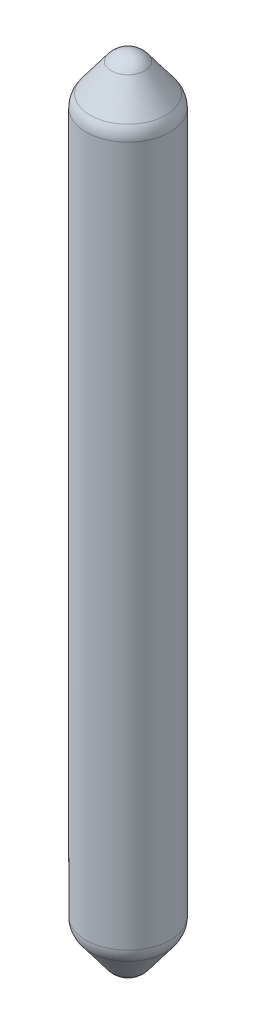
ISO-10303-21;
HEADER;
FILE_DESCRIPTION(('STEP AP214'),'2;1');
FILE_NAME('part.step','',(''),(''),'','','');
FILE_SCHEMA(('AUTOMOTIVE_DESIGN { 1 0 10303 214 1 1 1 1 }'));
ENDSEC;
DATA;
#1=APPLICATION_CONTEXT('core data for automotive mechanical design processes');
#2=APPLICATION_PROTOCOL_DEFINITION('international standard','automotive_design',2000,#1);
#3=PRODUCT_CONTEXT('',#1,'mechanical');
#4=PRODUCT('Part','Part','',(#3));
#5=PRODUCT_RELATED_PRODUCT_CATEGORY('part','',(#4));
#6=PRODUCT_DEFINITION_FORMATION('','',#4);
#7=PRODUCT_DEFINITION_CONTEXT('part definition',#1,'design');
#8=PRODUCT_DEFINITION('design','',#6,#7);
#9=PRODUCT_DEFINITION_SHAPE('','',#8);
#10=(LENGTH_UNIT() NAMED_UNIT(*) SI_UNIT(.MILLI.,.METRE.));
#11=(NAMED_UNIT(*) PLANE_ANGLE_UNIT() SI_UNIT($,.RADIAN.));
#12=(NAMED_UNIT(*) SI_UNIT($,.STERADIAN.) SOLID_ANGLE_UNIT());
#13=UNCERTAINTY_MEASURE_WITH_UNIT(LENGTH_MEASURE(1.E-05),#10,'distance_accuracy_value','');
#14=(GEOMETRIC_REPRESENTATION_CONTEXT(3) GLOBAL_UNCERTAINTY_ASSIGNED_CONTEXT((#13)) GLOBAL_UNIT_ASSIGNED_CONTEXT((#10,
#11,#12)) REPRESENTATION_CONTEXT('',''));
#15=CARTESIAN_POINT('',(0.,0.,0.));
#16=DIRECTION('',(0.,0.,1.));
#17=DIRECTION('',(1.,0.,0.));
#18=AXIS2_PLACEMENT_3D('',#15,#16,#17);
#19=CARTESIAN_POINT('',(0.,170.,0.));
#20=DIRECTION('',(0.,-1.,0.));
#21=DIRECTION('',(0.,0.,-1.));
#22=AXIS2_PLACEMENT_3D('',#19,#20,#21);
#23=CYLINDRICAL_SURFACE('',#22,20.);
#24=CARTESIAN_POINT('',(0.,166.666666666667,0.));
#25=DIRECTION('',(0.,-1.,0.));
#26=DIRECTION('',(1.,0.,0.));
#27=AXIS2_PLACEMENT_3D('',#24,#25,#26);
#28=CIRCLE('',#27,20.);
#29=CARTESIAN_POINT('',(20.,166.666666666667,0.));
#30=VERTEX_POINT('',#29);
#31=EDGE_CURVE('E42',#30,#30,#28,.T.);
#32=ORIENTED_EDGE('',*,*,#31,.T.);
#33=EDGE_LOOP('',(#32));
#34=FACE_BOUND('',#33,.T.);
#35=CARTESIAN_POINT('',(0.,-166.666666666667,0.));
#36=DIRECTION('',(0.,1.,0.));
#37=DIRECTION('',(-1.,0.,0.));
#38=AXIS2_PLACEMENT_3D('',#35,#36,#37);
#39=CIRCLE('',#38,20.);
#40=CARTESIAN_POINT('',(-20.,-166.666666666667,0.));
#41=VERTEX_POINT('',#40);
#42=EDGE_CURVE('E48',#41,#41,#39,.T.);
#43=ORIENTED_EDGE('',*,*,#42,.T.);
#44=EDGE_LOOP('',(#43));
#45=FACE_BOUND('',#44,.T.);
#46=ADVANCED_FACE('F40',(#34,#45),#23,.T.);
#47=CARTESIAN_POINT('',(0.,-170.,0.));
#48=DIRECTION('',(0.,1.,0.));
#49=DIRECTION('',(-1.,0.,0.));
#50=AXIS2_PLACEMENT_3D('',#47,#48,#49);
#51=CONICAL_SURFACE('',#50,20.0000000000001,0.643501108793283);
#52=CARTESIAN_POINT('',(0.,-172.666666666667,0.));
#53=DIRECTION('',(0.,-1.,0.));
#54=DIRECTION('',(1.,0.,0.));
#55=AXIS2_PLACEMENT_3D('',#52,#53,#54);
#56=CIRCLE('',#55,18.0000000000001);
#57=CARTESIAN_POINT('',(18.0000000000002,-172.666666666667,0.));
#58=VERTEX_POINT('',#57);
#59=EDGE_CURVE('E10',#58,#58,#56,.T.);
#60=ORIENTED_EDGE('',*,*,#59,.T.);
#61=EDGE_LOOP('',(#60));
#62=FACE_BOUND('',#61,.T.);
#63=CARTESIAN_POINT('',(0.,-186.,0.));
#64=DIRECTION('',(0.,-1.,0.));
#65=DIRECTION('',(1.,0.,0.));
#66=AXIS2_PLACEMENT_3D('',#63,#64,#65);
#67=CIRCLE('',#66,8.00000000000011);
#68=CARTESIAN_POINT('',(8.00000000000018,-186.,0.));
#69=VERTEX_POINT('',#68);
#70=EDGE_CURVE('E60',#69,#69,#67,.T.);
#71=ORIENTED_EDGE('',*,*,#70,.F.);
#72=EDGE_LOOP('',(#71));
#73=FACE_BOUND('',#72,.T.);
#74=ADVANCED_FACE('F78',(#62,#73),#51,.T.);
#75=CARTESIAN_POINT('',(0.,-180.,0.));
#76=DIRECTION('',(0.,-1.,0.));
#77=DIRECTION('',(-1.,0.,0.));
#78=AXIS2_PLACEMENT_3D('',#75,#76,#77);
#79=SPHERICAL_SURFACE('',#78,10.);
#80=ORIENTED_EDGE('',*,*,#70,.T.);
#81=EDGE_LOOP('',(#80));
#82=FACE_BOUND('',#81,.T.);
#83=ADVANCED_FACE('F80',(#82),#79,.T.);
#84=CARTESIAN_POINT('',(0.,170.,0.));
#85=DIRECTION('',(0.,-1.,0.));
#86=DIRECTION('',(-1.,0.,0.));
#87=AXIS2_PLACEMENT_3D('',#84,#85,#86);
#88=CONICAL_SURFACE('',#87,20.0000000000001,0.643501108793283);
#89=CARTESIAN_POINT('',(0.,172.666666666667,0.));
#90=DIRECTION('',(0.,1.,0.));
#91=DIRECTION('',(-1.,0.,0.));
#92=AXIS2_PLACEMENT_3D('',#89,#90,#91);
#93=CIRCLE('',#92,18.);
#94=CARTESIAN_POINT('',(-17.9999999999999,172.666666666667,0.));
#95=VERTEX_POINT('',#94);
#96=EDGE_CURVE('E55',#95,#95,#93,.T.);
#97=ORIENTED_EDGE('',*,*,#96,.T.);
#98=EDGE_LOOP('',(#97));
#99=FACE_BOUND('',#98,.T.);
#100=CARTESIAN_POINT('',(0.,186.,0.));
#101=DIRECTION('',(0.,-1.,0.));
#102=DIRECTION('',(1.,0.,0.));
#103=AXIS2_PLACEMENT_3D('',#100,#101,#102);
#104=CIRCLE('',#103,8.00000000000011);
#105=CARTESIAN_POINT('',(8.00000000000018,186.,0.));
#106=VERTEX_POINT('',#105);
#107=EDGE_CURVE('E58',#106,#106,#104,.T.);
#108=ORIENTED_EDGE('',*,*,#107,.T.);
#109=EDGE_LOOP('',(#108));
#110=FACE_BOUND('',#109,.T.);
#111=ADVANCED_FACE('F61',(#99,#110),#88,.T.);
#112=CARTESIAN_POINT('',(0.,180.,0.));
#113=DIRECTION('',(0.,1.,0.));
#114=DIRECTION('',(-1.,0.,0.));
#115=AXIS2_PLACEMENT_3D('',#112,#113,#114);
#116=SPHERICAL_SURFACE('',#115,10.);
#117=ORIENTED_EDGE('',*,*,#107,.F.);
#118=EDGE_LOOP('',(#117));
#119=FACE_BOUND('',#118,.T.);
#120=ADVANCED_FACE('F67',(#119),#116,.T.);
#121=CARTESIAN_POINT('',(0.,166.666666666667,0.));
#122=DIRECTION('',(0.,-1.,0.));
#123=DIRECTION('',(1.,0.,0.));
#124=AXIS2_PLACEMENT_3D('',#121,#122,#123);
#125=DEGENERATE_TOROIDAL_SURFACE('',#124,10.,10.,.T.);
#126=ORIENTED_EDGE('',*,*,#31,.F.);
#127=EDGE_LOOP('',(#126));
#128=FACE_BOUND('',#127,.T.);
#129=ORIENTED_EDGE('',*,*,#96,.F.);
#130=EDGE_LOOP('',(#129));
#131=FACE_BOUND('',#130,.T.);
#132=ADVANCED_FACE('F70',(#128,#131),#125,.T.);
#133=CARTESIAN_POINT('',(0.,-166.666666666667,0.));
#134=DIRECTION('',(0.,1.,0.));
#135=DIRECTION('',(-1.,0.,0.));
#136=AXIS2_PLACEMENT_3D('',#133,#134,#135);
#137=TOROIDAL_SURFACE('',#136,10.,10.);
#138=ORIENTED_EDGE('',*,*,#42,.F.);
#139=EDGE_LOOP('',(#138));
#140=FACE_BOUND('',#139,.T.);
#141=ORIENTED_EDGE('',*,*,#59,.F.);
#142=EDGE_LOOP('',(#141));
#143=FACE_BOUND('',#142,.T.);
#144=ADVANCED_FACE('F39',(#140,#143),#137,.T.);
#145=CLOSED_SHELL('',(#46,#74,#83,#111,#120,#132,#144));
#146=MANIFOLD_SOLID_BREP('B2',#145);
#147=ADVANCED_BREP_SHAPE_REPRESENTATION('',(#18,#146),#14);
#148=SHAPE_DEFINITION_REPRESENTATION(#9,#147);
ENDSEC;
END-ISO-10303-21;
